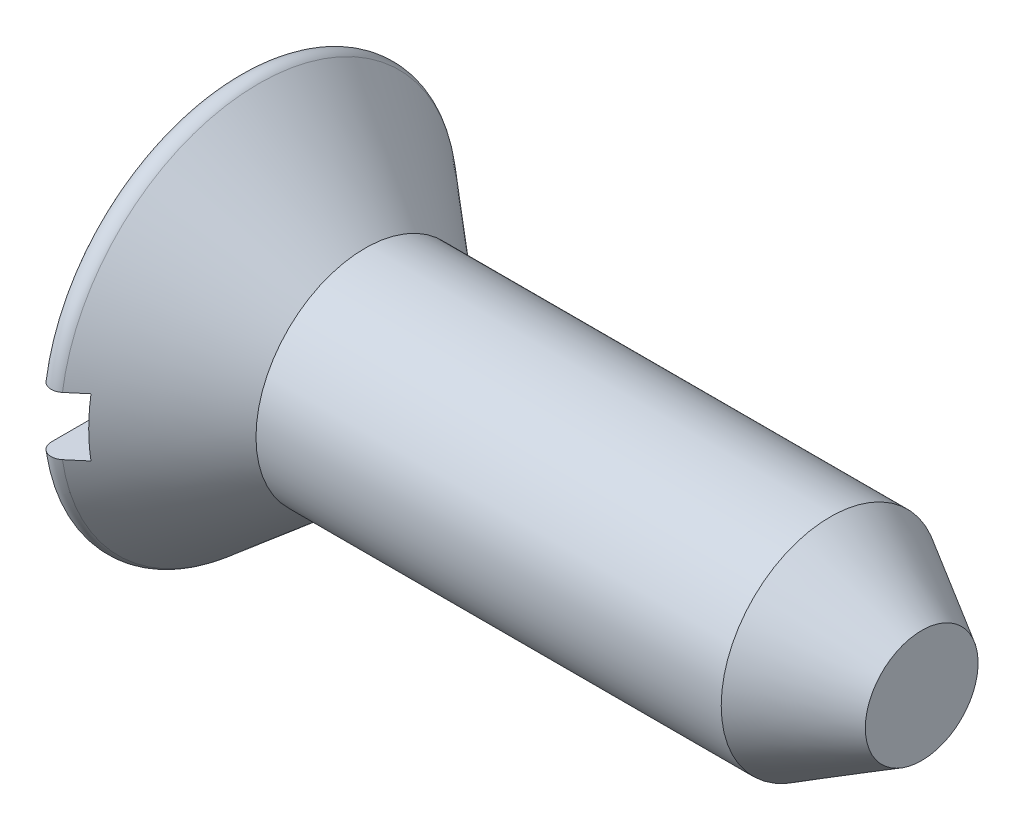
ISO-10303-21;
HEADER;
FILE_DESCRIPTION(('STEP AP214'),'2;1');
FILE_NAME('part.step','',(''),(''),'','','');
FILE_SCHEMA(('AUTOMOTIVE_DESIGN { 1 0 10303 214 1 1 1 1 }'));
ENDSEC;
DATA;
#1=APPLICATION_CONTEXT('core data for automotive mechanical design processes');
#2=APPLICATION_PROTOCOL_DEFINITION('international standard','automotive_design',2000,#1);
#3=PRODUCT_CONTEXT('',#1,'mechanical');
#4=PRODUCT('Part','Part','',(#3));
#5=PRODUCT_RELATED_PRODUCT_CATEGORY('part','',(#4));
#6=PRODUCT_DEFINITION_FORMATION('','',#4);
#7=PRODUCT_DEFINITION_CONTEXT('part definition',#1,'design');
#8=PRODUCT_DEFINITION('design','',#6,#7);
#9=PRODUCT_DEFINITION_SHAPE('','',#8);
#10=(LENGTH_UNIT() NAMED_UNIT(*) SI_UNIT(.MILLI.,.METRE.));
#11=(NAMED_UNIT(*) PLANE_ANGLE_UNIT() SI_UNIT($,.RADIAN.));
#12=(NAMED_UNIT(*) SI_UNIT($,.STERADIAN.) SOLID_ANGLE_UNIT());
#13=UNCERTAINTY_MEASURE_WITH_UNIT(LENGTH_MEASURE(1.E-05),#10,'distance_accuracy_value','');
#14=(GEOMETRIC_REPRESENTATION_CONTEXT(3) GLOBAL_UNCERTAINTY_ASSIGNED_CONTEXT((#13)) GLOBAL_UNIT_ASSIGNED_CONTEXT((#10,
#11,#12)) REPRESENTATION_CONTEXT('',''));
#15=CARTESIAN_POINT('',(0.,0.,0.));
#16=DIRECTION('',(0.,0.,1.));
#17=DIRECTION('',(1.,0.,0.));
#18=AXIS2_PLACEMENT_3D('',#15,#16,#17);
#19=CARTESIAN_POINT('',(0.,0.,0.));
#20=DIRECTION('',(-1.,0.,0.));
#21=DIRECTION('',(0.,0.,1.));
#22=AXIS2_PLACEMENT_3D('',#19,#20,#21);
#23=CYLINDRICAL_SURFACE('',#22,0.762);
#24=CARTESIAN_POINT('',(0.889,0.,0.));
#25=DIRECTION('',(-1.,0.,0.));
#26=DIRECTION('',(0.,0.,1.));
#27=AXIS2_PLACEMENT_3D('',#24,#25,#26);
#28=CIRCLE('',#27,0.762);
#29=CARTESIAN_POINT('',(0.889,0.,0.762));
#30=VERTEX_POINT('',#29);
#31=EDGE_CURVE('E164',#30,#30,#28,.T.);
#32=ORIENTED_EDGE('',*,*,#31,.F.);
#33=EDGE_LOOP('',(#32));
#34=FACE_BOUND('',#33,.T.);
#35=CARTESIAN_POINT('',(4.13728568757237,0.,0.));
#36=DIRECTION('',(-1.,0.,0.));
#37=DIRECTION('',(0.,0.,1.));
#38=AXIS2_PLACEMENT_3D('',#35,#36,#37);
#39=CIRCLE('',#38,0.762);
#40=CARTESIAN_POINT('',(4.13728568757237,0.,0.762));
#41=VERTEX_POINT('',#40);
#42=EDGE_CURVE('E213',#41,#41,#39,.T.);
#43=ORIENTED_EDGE('',*,*,#42,.T.);
#44=EDGE_LOOP('',(#43));
#45=FACE_BOUND('',#44,.T.);
#46=ADVANCED_FACE('F68',(#34,#45),#23,.T.);
#47=CARTESIAN_POINT('',(0.,0.,0.));
#48=DIRECTION('',(1.,0.,0.));
#49=DIRECTION('',(0.,0.,-1.));
#50=AXIS2_PLACEMENT_3D('',#47,#48,#49);
#51=PLANE('',#50);
#52=CARTESIAN_POINT('',(0.,0.,0.));
#53=DIRECTION('',(-1.,0.,0.));
#54=DIRECTION('',(0.,0.,1.));
#55=AXIS2_PLACEMENT_3D('',#52,#53,#54);
#56=CIRCLE('',#55,1.3173129068833);
#57=CARTESIAN_POINT('',(0.,0.2032,1.30154640894643));
#58=VERTEX_POINT('',#57);
#59=CARTESIAN_POINT('',(0.,0.2032,-1.30154640894642));
#60=VERTEX_POINT('',#59);
#61=EDGE_CURVE('E153',#58,#60,#56,.T.);
#62=ORIENTED_EDGE('',*,*,#61,.T.);
#63=DIRECTION('',(0.,0.,1.));
#64=VECTOR('',#63,1.);
#65=CARTESIAN_POINT('',(0.,0.2032,-1.4062129068833));
#66=LINE('',#65,#64);
#67=EDGE_CURVE('E198',#60,#58,#66,.T.);
#68=ORIENTED_EDGE('',*,*,#67,.T.);
#69=EDGE_LOOP('',(#62,#68));
#70=FACE_BOUND('',#69,.T.);
#71=ADVANCED_FACE('F225',(#70),#51,.F.);
#72=CARTESIAN_POINT('',(0.0889,0.,0.));
#73=DIRECTION('',(-1.,0.,0.));
#74=DIRECTION('',(0.,0.,1.));
#75=AXIS2_PLACEMENT_3D('',#72,#73,#74);
#76=TOROIDAL_SURFACE('',#75,1.3173129068833,0.0889000000000001);
#77=CARTESIAN_POINT('',(0.146043818501133,0.,0.));
#78=DIRECTION('',(-1.,0.,0.));
#79=DIRECTION('',(0.,0.,1.));
#80=AXIS2_PLACEMENT_3D('',#77,#78,#79);
#81=CIRCLE('',#80,1.38541425787658);
#82=CARTESIAN_POINT('',(0.146043818501124,0.2032,1.3704314743641));
#83=VERTEX_POINT('',#82);
#84=CARTESIAN_POINT('',(0.146043818501134,0.2032,-1.37043147436409));
#85=VERTEX_POINT('',#84);
#86=EDGE_CURVE('E160',#83,#85,#81,.T.);
#87=ORIENTED_EDGE('',*,*,#86,.T.);
#88=CARTESIAN_POINT('',(0.0523705260571728,0.2032,-1.38351851820252));
#89=CARTESIAN_POINT('',(0.0478176911994154,0.2032,-1.38144422272468));
#90=CARTESIAN_POINT('',(0.0434378443788568,0.2032,-1.37898096159876));
#91=CARTESIAN_POINT('',(0.0351518160236288,0.2032,-1.37334990482933));
#92=CARTESIAN_POINT('',(0.0312462580125439,0.2032,-1.37018119694036));
#93=CARTESIAN_POINT('',(0.0240245304576158,0.2032,-1.36323710717479));
#94=CARTESIAN_POINT('',(0.0207078233273633,0.2032,-1.35946228470495));
#95=CARTESIAN_POINT('',(0.0147503905893634,0.2032,-1.35141429144588));
#96=CARTESIAN_POINT('',(0.0121095022127912,0.2032,-1.34714124101486));
#97=CARTESIAN_POINT('',(0.00755405427631246,0.2032,-1.33818164094041));
#98=CARTESIAN_POINT('',(0.00564538069511222,0.2032,-1.33349209892135));
#99=CARTESIAN_POINT('',(0.00263372759919715,0.2032,-1.32386086837332));
#100=CARTESIAN_POINT('',(0.00153082569774927,0.2032,-1.31891915560388));
#101=CARTESIAN_POINT('',(0.000152174149981007,0.2032,-1.30887237508656));
#102=CARTESIAN_POINT('',(-0.000115390923046634,0.2032,-1.30376618321717));
#103=CARTESIAN_POINT('',(0.000206043899451252,0.2032,-1.29358074523499));
#104=CARTESIAN_POINT('',(0.000795075349108541,0.2032,-1.28850150012175));
#105=CARTESIAN_POINT('',(0.00281857260061189,0.2032,-1.27848876872158));
#106=CARTESIAN_POINT('',(0.00425707516640125,0.2032,-1.27355609730819));
#107=CARTESIAN_POINT('',(0.00794412166933677,0.2032,-1.26400323504905));
#108=CARTESIAN_POINT('',(0.0101926621885808,0.2032,-1.25938304288492));
#109=CARTESIAN_POINT('',(0.015431154367101,0.2032,-1.25060241035431));
#110=CARTESIAN_POINT('',(0.0184188897560083,0.2032,-1.24644064846124));
#111=CARTESIAN_POINT('',(0.025057323142709,0.2032,-1.23868432814038));
#112=CARTESIAN_POINT('',(0.0287079888885195,0.2032,-1.23508974213503));
#113=CARTESIAN_POINT('',(0.036529543885261,0.2032,-1.22861027181804));
#114=CARTESIAN_POINT('',(0.0406947268231962,0.2032,-1.2257185009037));
#115=CARTESIAN_POINT('',(0.049456603032649,0.2032,-1.22068615885088));
#116=CARTESIAN_POINT('',(0.0540532628784797,0.2032,-1.21854552958367));
#117=CARTESIAN_POINT('',(0.0634830486287582,0.2032,-1.21510523257623));
#118=CARTESIAN_POINT('',(0.068312299574889,0.2032,-1.21379494107223));
#119=CARTESIAN_POINT('',(0.0781229945303598,0.2032,-1.21201227043655));
#120=CARTESIAN_POINT('',(0.0831044289937725,0.2032,-1.21153983885826));
#121=CARTESIAN_POINT('',(0.0930285365737473,0.2032,-1.21144808744044));
#122=CARTESIAN_POINT('',(0.0979711385161175,0.2032,-1.21182086184307));
#123=CARTESIAN_POINT('',(0.107723284516137,0.2032,-1.21339163580157));
#124=CARTESIAN_POINT('',(0.112532830720643,0.2032,-1.21458962203455));
#125=CARTESIAN_POINT('',(0.121880179357037,0.2032,-1.21777299744883));
#126=CARTESIAN_POINT('',(0.126418153919348,0.2032,-1.21975788165377));
#127=CARTESIAN_POINT('',(0.135100241639459,0.2032,-1.22445530379448));
#128=CARTESIAN_POINT('',(0.139244341144223,0.2032,-1.2271678669416));
#129=CARTESIAN_POINT('',(0.147058785243054,0.2032,-1.23326619394751));
#130=CARTESIAN_POINT('',(0.150724928905993,0.2032,-1.23665733913592));
#131=CARTESIAN_POINT('',(0.157444725568322,0.2032,-1.2440000363637));
#132=CARTESIAN_POINT('',(0.160498338768601,0.2032,-1.24795162478937));
#133=CARTESIAN_POINT('',(0.165947827436118,0.2032,-1.25635718007483));
#134=CARTESIAN_POINT('',(0.168334781786057,0.2032,-1.2608169309155));
#135=CARTESIAN_POINT('',(0.172335577477156,0.2032,-1.27007068730065));
#136=CARTESIAN_POINT('',(0.17394936864905,0.2032,-1.27486471451267));
#137=CARTESIAN_POINT('',(0.176375011779177,0.2032,-1.28470805384686));
#138=CARTESIAN_POINT('',(0.177177781162091,0.2032,-1.28975960579701));
#139=CARTESIAN_POINT('',(0.177928121542145,0.2032,-1.29992591539745));
#140=CARTESIAN_POINT('',(0.177875663162288,0.2032,-1.30504067521289));
#141=CARTESIAN_POINT('',(0.176913953003756,0.2032,-1.31521251318227));
#142=CARTESIAN_POINT('',(0.176000832504561,0.2032,-1.32026922647207));
#143=CARTESIAN_POINT('',(0.173335740450384,0.2032,-1.33015669985423));
#144=CARTESIAN_POINT('',(0.171583773579977,0.2032,-1.33498746120827));
#145=CARTESIAN_POINT('',(0.1672950951694,0.2032,-1.34426719603872));
#146=CARTESIAN_POINT('',(0.164761088604788,0.2032,-1.34871741901477));
#147=CARTESIAN_POINT('',(0.158975322179547,0.2032,-1.35712403812421));
#148=CARTESIAN_POINT('',(0.155723593179799,0.2032,-1.36108045547897));
#149=CARTESIAN_POINT('',(0.148626084326047,0.2032,-1.3683476561999));
#150=CARTESIAN_POINT('',(0.144786038152907,0.2032,-1.371664038558));
#151=CARTESIAN_POINT('',(0.136598649010813,0.2032,-1.3775964489811));
#152=CARTESIAN_POINT('',(0.13225135698471,0.2032,-1.38021254728906));
#153=CARTESIAN_POINT('',(0.123223844102275,0.2032,-1.38464056074995));
#154=CARTESIAN_POINT('',(0.118547773328544,0.2032,-1.38646093881404));
#155=CARTESIAN_POINT('',(0.108953581658436,0.2032,-1.38928396219947));
#156=CARTESIAN_POINT('',(0.104035411787491,0.2032,-1.39028644134007));
#157=CARTESIAN_POINT('',(0.0941387237719009,0.2032,-1.39143812964163));
#158=CARTESIAN_POINT('',(0.0891609499961608,0.2032,-1.39159377597214));
#159=CARTESIAN_POINT('',(0.0792546536102657,0.2032,-1.39106395624113));
#160=CARTESIAN_POINT('',(0.0743260770652091,0.2032,-1.39037954472566));
#161=CARTESIAN_POINT('',(0.0665501614656429,0.2032,-1.38862203209876));
#162=CARTESIAN_POINT('',(0.0636423816525081,0.2032,-1.38780545738067));
#163=CARTESIAN_POINT('',(0.0579255993947736,0.2032,-1.38587926170669));
#164=CARTESIAN_POINT('',(0.0551165964312887,0.2032,-1.38476964229045));
#165=CARTESIAN_POINT('',(0.0523705260571728,0.2032,-1.38351851820252));
#166=B_SPLINE_CURVE_WITH_KNOTS('',3,(#88,#89,#90,#91,#92,#93,#94,#95,#96,#97,#98,#99,#100,#101,
#102,#103,#104,#105,#106,#107,#108,#109,#110,#111,#112,#113,#114,#115,#116,#117,#118,#119,#120,
#121,#122,#123,#124,#125,#126,#127,#128,#129,#130,#131,#132,#133,#134,#135,#136,#137,#138,#139,
#140,#141,#142,#143,#144,#145,#146,#147,#148,#149,#150,#151,#152,#153,#154,#155,#156,#157,#158,
#159,#160,#161,#162,#163,#164,#165),.UNSPECIFIED.,.T.,.F.,(4,2,2,2,2,2,2,2,2,2,2,2,2,2,2,2,2,2,
2,2,2,2,2,2,2,2,2,2,2,2,2,2,2,2,2,2,2,2,4),(0.,0.0149981452684923,0.030015799157367,
0.0450196715059772,0.0600199268108142,0.075138355282125,0.0902582397936636,0.105525810312758,
0.120793943251991,0.136135222332715,0.151476436682675,0.166772200535348,0.182067220438667,
0.197205711261049,0.212343030299978,0.227282541806836,0.242221118127957,0.257020541353579,
0.271819725650868,0.286609428194935,0.301399643213061,0.316312161064546,0.331225647541866,
0.346330062522076,0.361435457469809,0.37670820161156,0.391981470371799,0.4073237223347,
0.422665888619108,0.437955572041762,0.453244598161255,0.468393124557555,0.483540130890253,
0.498521869958998,0.513506652260303,0.528377367454222,0.543229434136708,0.552275705320038,
0.561321928975245),.UNSPECIFIED.);
#167=EDGE_CURVE('E171',#85,#60,#166,.T.);
#168=ORIENTED_EDGE('',*,*,#167,.T.);
#169=ORIENTED_EDGE('',*,*,#61,.F.);
#170=CARTESIAN_POINT('',(0.0505339825479932,0.2032,1.22031559709616));
#171=CARTESIAN_POINT('',(0.046022360190876,0.2032,1.22250397816378));
#172=CARTESIAN_POINT('',(0.0416938618429052,0.2032,1.22507887974568));
#173=CARTESIAN_POINT('',(0.0335289146536868,0.2032,1.23092350038039));
#174=CARTESIAN_POINT('',(0.0296931348289091,0.2032,1.23419414845723));
#175=CARTESIAN_POINT('',(0.0226268431148383,0.2032,1.24132795738513));
#176=CARTESIAN_POINT('',(0.019395709317121,0.2032,1.24519050191818));
#177=CARTESIAN_POINT('',(0.0136214738029604,0.2032,1.25339760832912));
#178=CARTESIAN_POINT('',(0.0110782049312717,0.2032,1.25774205273998));
#179=CARTESIAN_POINT('',(0.00672420765881694,0.2032,1.26683485447658));
#180=CARTESIAN_POINT('',(0.00492070691249398,0.2032,1.271586672922));
#181=CARTESIAN_POINT('',(0.00212891806369629,0.2032,1.28132430281562));
#182=CARTESIAN_POINT('',(0.00114070876341374,0.2032,1.28631013683345));
#183=CARTESIAN_POINT('',(8.02056667534702E-07,0.2032,1.29642193072192));
#184=CARTESIAN_POINT('',(-0.000143324242251581,0.2032,1.30154874564883));
#185=CARTESIAN_POINT('',(0.000429758760486753,0.2032,1.31175411761621));
#186=CARTESIAN_POINT('',(0.00114698364483488,0.2032,1.31683267378196));
#187=CARTESIAN_POINT('',(0.00342616846316346,0.2032,1.3268042775906));
#188=CARTESIAN_POINT('',(0.0049893143388221,0.2032,1.33169705444917));
#189=CARTESIAN_POINT('',(0.00891975704861599,0.2032,1.34114832832208));
#190=CARTESIAN_POINT('',(0.0112870330609027,0.2032,1.3457068339882));
#191=CARTESIAN_POINT('',(0.0167446626189984,0.2032,1.35432961935332));
#192=CARTESIAN_POINT('',(0.0198305451819823,0.2032,1.3583967279404));
#193=CARTESIAN_POINT('',(0.0266478948671658,0.2032,1.36594827372239));
#194=CARTESIAN_POINT('',(0.0303793279907463,0.2032,1.3694327415837));
#195=CARTESIAN_POINT('',(0.0383405732510331,0.2032,1.37568129636799));
#196=CARTESIAN_POINT('',(0.0425648163415173,0.2032,1.37845247846991));
#197=CARTESIAN_POINT('',(0.0514223555663436,0.2032,1.38323774552473));
#198=CARTESIAN_POINT('',(0.0560556270622841,0.2032,1.38525187604132));
#199=CARTESIAN_POINT('',(0.0655486973042661,0.2032,1.38844509183823));
#200=CARTESIAN_POINT('',(0.0704056974884498,0.2032,1.3896324997109));
#201=CARTESIAN_POINT('',(0.0802504629919815,0.2032,1.39116939537549));
#202=CARTESIAN_POINT('',(0.085238222824734,0.2032,1.39151891826783));
#203=CARTESIAN_POINT('',(0.0951701675507164,0.2032,1.39136993806661));
#204=CARTESIAN_POINT('',(0.100114431553848,0.2032,1.39087664782308));
#205=CARTESIAN_POINT('',(0.109849837622273,0.2032,1.38906691509969));
#206=CARTESIAN_POINT('',(0.114640981261118,0.2032,1.38775048108177));
#207=CARTESIAN_POINT('',(0.123935144841926,0.2032,1.3843337741045));
#208=CARTESIAN_POINT('',(0.128438154113818,0.2032,1.38223347213695));
#209=CARTESIAN_POINT('',(0.137030565022314,0.2032,1.37731112774396));
#210=CARTESIAN_POINT('',(0.141119956834151,0.2032,1.37448906818005));
#211=CARTESIAN_POINT('',(0.148796924534544,0.2032,1.36818585521373));
#212=CARTESIAN_POINT('',(0.152381252773878,0.2032,1.36470074742102));
#213=CARTESIAN_POINT('',(0.158921048571228,0.2032,1.35718357066624));
#214=CARTESIAN_POINT('',(0.161876485284487,0.2032,1.35315147489235));
#215=CARTESIAN_POINT('',(0.167106739124593,0.2032,1.34461137440434));
#216=CARTESIAN_POINT('',(0.169374368047431,0.2032,1.34009896768549));
#217=CARTESIAN_POINT('',(0.173128744823218,0.2032,1.33076025386597));
#218=CARTESIAN_POINT('',(0.174615447015387,0.2032,1.32593392842901));
#219=CARTESIAN_POINT('',(0.176781012512135,0.2032,1.3160508558175));
#220=CARTESIAN_POINT('',(0.17745135494799,0.2032,1.31099224071179));
#221=CARTESIAN_POINT('',(0.177939118769774,0.2032,1.30083399335894));
#222=CARTESIAN_POINT('',(0.17775650286015,0.2032,1.29573435932798));
#223=CARTESIAN_POINT('',(0.17653988534682,0.2032,1.28560487606266));
#224=CARTESIAN_POINT('',(0.175500522134343,0.2032,1.28057566968653));
#225=CARTESIAN_POINT('',(0.172591481549488,0.2032,1.27076324509045));
#226=CARTESIAN_POINT('',(0.170721795099058,0.2032,1.26598002956059));
#227=CARTESIAN_POINT('',(0.166204707617217,0.2032,1.25680196176453));
#228=CARTESIAN_POINT('',(0.163558103977199,0.2032,1.25240671728952));
#229=CARTESIAN_POINT('',(0.157558425660052,0.2032,1.24412800137498));
#230=CARTESIAN_POINT('',(0.154205377457412,0.2032,1.24024451076599));
#231=CARTESIAN_POINT('',(0.146918136460609,0.2032,1.23313728015562));
#232=CARTESIAN_POINT('',(0.14298928688198,0.2032,1.22990806329491));
#233=CARTESIAN_POINT('',(0.134639378493955,0.2032,1.22416552102562));
#234=CARTESIAN_POINT('',(0.130218375763966,0.2032,1.22165211416848));
#235=CARTESIAN_POINT('',(0.121071540696351,0.2032,1.21744707731726));
#236=CARTESIAN_POINT('',(0.116350448769702,0.2032,1.21574513412656));
#237=CARTESIAN_POINT('',(0.106686482655857,0.2032,1.21316740208243));
#238=CARTESIAN_POINT('',(0.101743567449631,0.2032,1.2122917666928));
#239=CARTESIAN_POINT('',(0.0918327728676808,0.2032,1.21139933497423));
#240=CARTESIAN_POINT('',(0.0868656743034488,0.2032,1.21137379023067));
#241=CARTESIAN_POINT('',(0.0770026144411505,0.2032,1.21216050931684));
#242=CARTESIAN_POINT('',(0.0721065711473121,0.2032,1.21297171399455));
#243=CARTESIAN_POINT('',(0.0644247118200177,0.2032,1.21492056495721));
#244=CARTESIAN_POINT('',(0.0615712542986191,0.2032,1.21580160411902));
#245=CARTESIAN_POINT('',(0.0559682444172038,0.2032,1.21784800691337));
#246=CARTESIAN_POINT('',(0.0532186911599176,0.2032,1.21901336808998));
#247=CARTESIAN_POINT('',(0.0505339825479932,0.2032,1.22031559709616));
#248=B_SPLINE_CURVE_WITH_KNOTS('',3,(#170,#171,#172,#173,#174,#175,#176,#177,#178,#179,#180,
#181,#182,#183,#184,#185,#186,#187,#188,#189,#190,#191,#192,#193,#194,#195,#196,#197,#198,#199,
#200,#201,#202,#203,#204,#205,#206,#207,#208,#209,#210,#211,#212,#213,#214,#215,#216,#217,#218,
#219,#220,#221,#222,#223,#224,#225,#226,#227,#228,#229,#230,#231,#232,#233,#234,#235,#236,#237,
#238,#239,#240,#241,#242,#243,#244,#245,#246,#247),.UNSPECIFIED.,.T.,.F.,(4,2,2,2,2,2,2,2,2,2,2,
2,2,2,2,2,2,2,2,2,2,2,2,2,2,2,2,2,2,2,2,2,2,2,2,2,2,2,4),(0.,0.0150319921922779,
0.03008418389658,0.0451208075416984,0.0601537739086061,0.0753303039585673,0.0905083007279189,
0.105822232397158,0.121136441114667,0.13647217546799,0.151807512753742,0.167049873057424,
0.182291430849945,0.197374944565268,0.21245755032306,0.227386034595826,0.242313893477856,
0.257149756536103,0.271985467083563,0.28682172670327,0.301658338649959,0.316586378751056,
0.331515150847495,0.346594954827096,0.361675640424612,0.376912419695567,0.392149865200053,
0.407483398617733,0.422817099683431,0.438135117655419,0.453452561676344,0.468635942568744,
0.483817595126932,0.498800784822775,0.513786756683713,0.528618457366173,0.543431407188434,
0.552376497065563,0.561321509679334),.UNSPECIFIED.);
#249=EDGE_CURVE('E167',#58,#83,#248,.T.);
#250=ORIENTED_EDGE('',*,*,#249,.T.);
#251=EDGE_LOOP('',(#87,#168,#169,#250));
#252=FACE_BOUND('',#251,.T.);
#253=ADVANCED_FACE('F205',(#252),#76,.T.);
#254=CARTESIAN_POINT('',(0.,-0.2032,-1.30154640894645));
#255=VERTEX_POINT('',#254);
#256=CARTESIAN_POINT('',(0.,-0.2032,1.30154640894642));
#257=VERTEX_POINT('',#256);
#258=EDGE_CURVE('E155',#255,#257,#56,.T.);
#259=ORIENTED_EDGE('',*,*,#258,.T.);
#260=DIRECTION('',(0.,0.,1.));
#261=VECTOR('',#260,1.);
#262=CARTESIAN_POINT('',(0.,-0.2032,-1.4062129068833));
#263=LINE('',#262,#261);
#264=EDGE_CURVE('E140',#255,#257,#263,.T.);
#265=ORIENTED_EDGE('',*,*,#264,.F.);
#266=EDGE_LOOP('',(#259,#265));
#267=FACE_BOUND('',#266,.T.);
#268=ADVANCED_FACE('F70',(#267),#51,.F.);
#269=ORIENTED_EDGE('',*,*,#258,.F.);
#270=CARTESIAN_POINT('',(0.0523705260571728,-0.2032,-1.38351851820252));
#271=CARTESIAN_POINT('',(0.0568738869315067,-0.2032,-1.38556977864343));
#272=CARTESIAN_POINT('',(0.0615529950224517,-0.2032,-1.38724351739871));
#273=CARTESIAN_POINT('',(0.0711294816637933,-0.2032,-1.38978319032185));
#274=CARTESIAN_POINT('',(0.0760270977246517,-0.2032,-1.39064822187822));
#275=CARTESIAN_POINT('',(0.085896824871141,-0.2032,-1.39154221376192));
#276=CARTESIAN_POINT('',(0.0908689097175361,-0.2032,-1.39157146195357));
#277=CARTESIAN_POINT('',(0.100745903817341,-0.2032,-1.39079351802843));
#278=CARTESIAN_POINT('',(0.105650828358372,-0.2032,-1.38998651958387));
#279=CARTESIAN_POINT('',(0.115250174320876,-0.2032,-1.38756210636323));
#280=CARTESIAN_POINT('',(0.11994482516555,-0.2032,-1.38594559950222));
#281=CARTESIAN_POINT('',(0.128997937802608,-0.2032,-1.38195064861717));
#282=CARTESIAN_POINT('',(0.133356383511365,-0.2032,-1.3795721681693));
#283=CARTESIAN_POINT('',(0.141634598549902,-0.2032,-1.37411112551113));
#284=CARTESIAN_POINT('',(0.145552363884049,-0.2032,-1.37102552651549));
#285=CARTESIAN_POINT('',(0.15282015249136,-0.2032,-1.36424588588495));
#286=CARTESIAN_POINT('',(0.156170152340115,-0.2032,-1.36055181915877));
#287=CARTESIAN_POINT('',(0.162240866998053,-0.2032,-1.35262411672948));
#288=CARTESIAN_POINT('',(0.164955489970198,-0.2032,-1.34838581678166));
#289=CARTESIAN_POINT('',(0.169643430037304,-0.2032,-1.33951742871808));
#290=CARTESIAN_POINT('',(0.17161670582861,-0.2032,-1.3348873187905));
#291=CARTESIAN_POINT('',(0.174787843067183,-0.2032,-1.32531348340902));
#292=CARTESIAN_POINT('',(0.175977152187734,-0.2032,-1.32036692464392));
#293=CARTESIAN_POINT('',(0.177515761242304,-0.2032,-1.3103448060864));
#294=CARTESIAN_POINT('',(0.177865017072497,-0.2032,-1.30526923953505));
#295=CARTESIAN_POINT('',(0.177714472162631,-0.2032,-1.29508994048273));
#296=CARTESIAN_POINT('',(0.177207854788847,-0.2032,-1.28998630760395));
#297=CARTESIAN_POINT('',(0.175346450120294,-0.2032,-1.27993599750868));
#298=CARTESIAN_POINT('',(0.173991644274783,-0.2032,-1.27498932372753));
#299=CARTESIAN_POINT('',(0.170467529105051,-0.2032,-1.26538662370606));
#300=CARTESIAN_POINT('',(0.16829701852541,-0.2032,-1.26073103799142));
#301=CARTESIAN_POINT('',(0.163200281892077,-0.2032,-1.25185353800251));
#302=CARTESIAN_POINT('',(0.160274074018854,-0.2032,-1.2476316132987));
#303=CARTESIAN_POINT('',(0.153767751125295,-0.2032,-1.23977238428597));
#304=CARTESIAN_POINT('',(0.150192042465925,-0.2032,-1.23613143358229));
#305=CARTESIAN_POINT('',(0.14247343220887,-0.2032,-1.22951058927975));
#306=CARTESIAN_POINT('',(0.138330568305628,-0.2032,-1.22653065178289));
#307=CARTESIAN_POINT('',(0.12964941864497,-0.2032,-1.2213558530589));
#308=CARTESIAN_POINT('',(0.125116605490789,-0.2032,-1.21915181179969));
#309=CARTESIAN_POINT('',(0.11574215598987,-0.2032,-1.21554678270195));
#310=CARTESIAN_POINT('',(0.110900543088878,-0.2032,-1.21414573397635));
#311=CARTESIAN_POINT('',(0.101109367186439,-0.2032,-1.21220274985597));
#312=CARTESIAN_POINT('',(0.0961618387659196,-0.2032,-1.21165055289154));
#313=CARTESIAN_POINT('',(0.086244713661789,-0.2032,-1.21138997353124));
#314=CARTESIAN_POINT('',(0.0812751179651708,-0.2032,-1.21168155376823));
#315=CARTESIAN_POINT('',(0.0714850068829292,-0.2032,-1.21309522115609));
#316=CARTESIAN_POINT('',(0.066663796652455,-0.2032,-1.21421250563169));
#317=CARTESIAN_POINT('',(0.0572763452795233,-0.2032,-1.21723776664842));
#318=CARTESIAN_POINT('',(0.0527101062802414,-0.2032,-1.21914574983468));
#319=CARTESIAN_POINT('',(0.0439429991238042,-0.2032,-1.2237033270949));
#320=CARTESIAN_POINT('',(0.0397435317435436,-0.2032,-1.22635561419743));
#321=CARTESIAN_POINT('',(0.0318431629909132,-0.2032,-1.23232032620685));
#322=CARTESIAN_POINT('',(0.0281422869444045,-0.2032,-1.23563278462586));
#323=CARTESIAN_POINT('',(0.0212998583799315,-0.2032,-1.24286228473645));
#324=CARTESIAN_POINT('',(0.0181649374636797,-0.2032,-1.2467856019428));
#325=CARTESIAN_POINT('',(0.0125883328527559,-0.2032,-1.25509730226339));
#326=CARTESIAN_POINT('',(0.0101466981635355,-0.2032,-1.25948571822339));
#327=CARTESIAN_POINT('',(0.00599383119983193,-0.2032,-1.26866335675254));
#328=CARTESIAN_POINT('',(0.00429233350146967,-0.2032,-1.27345698533044));
#329=CARTESIAN_POINT('',(0.00171053826733786,-0.2032,-1.28326056390028));
#330=CARTESIAN_POINT('',(0.000830286667440538,-0.2032,-1.28827052597629));
#331=CARTESIAN_POINT('',(-8.94328821223963E-05,-0.2032,-1.29841043180401));
#332=CARTESIAN_POINT('',(-0.00012164423251248,-0.2032,-1.30354103530056));
#333=CARTESIAN_POINT('',(0.000674810675428988,-0.2032,-1.31373491057774));
#334=CARTESIAN_POINT('',(0.00150345821041084,-0.2032,-1.31879818382035));
#335=CARTESIAN_POINT('',(0.00400129511261879,-0.2032,-1.32871729903732));
#336=CARTESIAN_POINT('',(0.00567113217204995,-0.2032,-1.33357297803977));
#337=CARTESIAN_POINT('',(0.00980803669808783,-0.2032,-1.34293367869137));
#338=CARTESIAN_POINT('',(0.0122752810995478,-0.2032,-1.34743862224109));
#339=CARTESIAN_POINT('',(0.0179219347837412,-0.2032,-1.3559381838167));
#340=CARTESIAN_POINT('',(0.0210969932093923,-0.2032,-1.35993569487923));
#341=CARTESIAN_POINT('',(0.0280775177618349,-0.2032,-1.3673298802076));
#342=CARTESIAN_POINT('',(0.0318821810161565,-0.2032,-1.37072730843663));
#343=CARTESIAN_POINT('',(0.0384979433797086,-0.2032,-1.37568731174336));
#344=CARTESIAN_POINT('',(0.0411524940783324,-0.2032,-1.37746243450377));
#345=CARTESIAN_POINT('',(0.0466371922972352,-0.2032,-1.3807168425844));
#346=CARTESIAN_POINT('',(0.0494673388170149,-0.2032,-1.38219612959001));
#347=CARTESIAN_POINT('',(0.0523705260571728,-0.2032,-1.38351851820252));
#348=B_SPLINE_CURVE_WITH_KNOTS('',3,(#270,#271,#272,#273,#274,#275,#276,#277,#278,#279,#280,
#281,#282,#283,#284,#285,#286,#287,#288,#289,#290,#291,#292,#293,#294,#295,#296,#297,#298,#299,
#300,#301,#302,#303,#304,#305,#306,#307,#308,#309,#310,#311,#312,#313,#314,#315,#316,#317,#318,
#319,#320,#321,#322,#323,#324,#325,#326,#327,#328,#329,#330,#331,#332,#333,#334,#335,#336,#337,
#338,#339,#340,#341,#342,#343,#344,#345,#346,#347),.UNSPECIFIED.,.T.,.F.,(4,2,2,2,2,2,2,2,2,2,2,
2,2,2,2,2,2,2,2,2,2,2,2,2,2,2,2,2,2,2,2,2,2,2,2,2,2,2,4),(0.,0.0148340012625774,
0.0296845393021099,0.044529962389818,0.0593719480900148,0.074197324718111,0.0890234101340763,
0.103914402057001,0.118806008190924,0.133835023770037,0.148864876556438,0.164056090489379,
0.179248101962218,0.194561682035036,0.209875597043092,0.225212153175321,0.240548340376994,
0.255784125898675,0.271018899306144,0.286066832248387,0.301113624027129,0.315977047058377,
0.330839811864953,0.345616801714081,0.360393915753377,0.375225201179755,0.390057239674916,
0.405053153467774,0.420050126994201,0.435238785392362,0.450428293307434,0.465747734529259,
0.481066842566105,0.496397763954011,0.511732089422387,0.526974635375748,0.542197891727271,
0.551761000202218,0.561324054194059),.UNSPECIFIED.);
#349=CARTESIAN_POINT('',(0.146043818501124,-0.2032,-1.3704314743641));
#350=VERTEX_POINT('',#349);
#351=EDGE_CURVE('E197',#255,#350,#348,.T.);
#352=ORIENTED_EDGE('',*,*,#351,.T.);
#353=CARTESIAN_POINT('',(0.146043818501133,-0.2032,1.37043147436409));
#354=VERTEX_POINT('',#353);
#355=EDGE_CURVE('E146',#350,#354,#81,.T.);
#356=ORIENTED_EDGE('',*,*,#355,.T.);
#357=CARTESIAN_POINT('',(0.0505339825479932,-0.2032,1.22031559709616));
#358=CARTESIAN_POINT('',(0.05497646615682,-0.2032,1.21816125152755));
#359=CARTESIAN_POINT('',(0.059602889478724,-0.2032,1.21637848037792));
#360=CARTESIAN_POINT('',(0.0690928683098398,-0.2032,1.21361305110179));
#361=CARTESIAN_POINT('',(0.0739566728862113,-0.2032,1.21263125337525));
#362=CARTESIAN_POINT('',(0.0837793768362527,-0.2032,1.21150030271955));
#363=CARTESIAN_POINT('',(0.0887382515048846,-0.2032,1.21135093633939));
#364=CARTESIAN_POINT('',(0.0986091066424504,-0.2032,1.21188917263747));
#365=CARTESIAN_POINT('',(0.103521097456153,-0.2032,1.21257658616909));
#366=CARTESIAN_POINT('',(0.113149231726987,-0.2032,1.21476429271532));
#367=CARTESIAN_POINT('',(0.117865776333502,-0.2032,1.21626282185985));
#368=CARTESIAN_POINT('',(0.126982592943378,-0.2032,1.22002606775215));
#369=CARTESIAN_POINT('',(0.131382848161706,-0.2032,1.22229082512621));
#370=CARTESIAN_POINT('',(0.139770456665416,-0.2032,1.22753418009996));
#371=CARTESIAN_POINT('',(0.143755282545398,-0.2032,1.23051681887917));
#372=CARTESIAN_POINT('',(0.151175176282735,-0.2032,1.23710141120585));
#373=CARTESIAN_POINT('',(0.154610212646939,-0.2032,1.24070340020657));
#374=CARTESIAN_POINT('',(0.160877454036404,-0.2032,1.24847052052895));
#375=CARTESIAN_POINT('',(0.163701900627754,-0.2032,1.25264191159921));
#376=CARTESIAN_POINT('',(0.168620360830881,-0.2032,1.26139508591017));
#377=CARTESIAN_POINT('',(0.170714325906445,-0.2032,1.26597689639542));
#378=CARTESIAN_POINT('',(0.174138195104187,-0.2032,1.2754812966625));
#379=CARTESIAN_POINT('',(0.175458417895567,-0.2032,1.28040737549475));
#380=CARTESIAN_POINT('',(0.177259483144653,-0.2032,1.2904107334191));
#381=CARTESIAN_POINT('',(0.177740285464561,-0.2032,1.29548801972955));
#382=CARTESIAN_POINT('',(0.177849620300328,-0.2032,1.30568694566465));
#383=CARTESIAN_POINT('',(0.177472256892997,-0.2032,1.31080864982556));
#384=CARTESIAN_POINT('',(0.17586224100372,-0.2032,1.32091594628616));
#385=CARTESIAN_POINT('',(0.174629583558533,-0.2032,1.32590153779581));
#386=CARTESIAN_POINT('',(0.171342912582113,-0.2032,1.33558868070765));
#387=CARTESIAN_POINT('',(0.169289746040575,-0.2032,1.34029051927733));
#388=CARTESIAN_POINT('',(0.16441718274424,-0.2032,1.34927898188929));
#389=CARTESIAN_POINT('',(0.16159781264843,-0.2032,1.35356562037083));
#390=CARTESIAN_POINT('',(0.155295369346087,-0.2032,1.36156540151497));
#391=CARTESIAN_POINT('',(0.151817642122356,-0.2032,1.36528275490481));
#392=CARTESIAN_POINT('',(0.144281402032941,-0.2032,1.37207299273043));
#393=CARTESIAN_POINT('',(0.140222923126113,-0.2032,1.37514591482279));
#394=CARTESIAN_POINT('',(0.13168742473562,-0.2032,1.38052482920098));
#395=CARTESIAN_POINT('',(0.127215398827258,-0.2032,1.38283874584233));
#396=CARTESIAN_POINT('',(0.117943747525303,-0.2032,1.3866747986542));
#397=CARTESIAN_POINT('',(0.11314414065771,-0.2032,1.38819697955862));
#398=CARTESIAN_POINT('',(0.103401814538097,-0.2032,1.39039274090956));
#399=CARTESIAN_POINT('',(0.0984608507319749,-0.2032,1.39107411477661));
#400=CARTESIAN_POINT('',(0.0885348566885375,-0.2032,1.39159359434429));
#401=CARTESIAN_POINT('',(0.0835498279327388,-0.2032,1.3914317282888));
#402=CARTESIAN_POINT('',(0.073700406882297,-0.2032,1.39027227711033));
#403=CARTESIAN_POINT('',(0.0688355790411138,-0.2032,1.38927838599898));
#404=CARTESIAN_POINT('',(0.0593413489156044,-0.2032,1.38648952973411));
#405=CARTESIAN_POINT('',(0.0547119468040556,-0.2032,1.3846945639927));
#406=CARTESIAN_POINT('',(0.04580915438365,-0.2032,1.38035246069457));
#407=CARTESIAN_POINT('',(0.0415364941703807,-0.2032,1.37780382686052));
#408=CARTESIAN_POINT('',(0.0334754766450085,-0.2032,1.37203056275749));
#409=CARTESIAN_POINT('',(0.0296871346657004,-0.2032,1.36880591109531));
#410=CARTESIAN_POINT('',(0.0226704223789446,-0.2032,1.36174652352465));
#411=CARTESIAN_POINT('',(0.0194465705972939,-0.2032,1.35790729735676));
#412=CARTESIAN_POINT('',(0.0136811130818397,-0.2032,1.34974691816245));
#413=CARTESIAN_POINT('',(0.0111395454079594,-0.2032,1.34542573827018));
#414=CARTESIAN_POINT('',(0.00678214111538742,-0.2032,1.33637504588101));
#415=CARTESIAN_POINT('',(0.00497430427168451,-0.2032,1.33164168187396));
#416=CARTESIAN_POINT('',(0.00217045768061073,-0.2032,1.32194031724727));
#417=CARTESIAN_POINT('',(0.00117449520380307,-0.2032,1.31697230298316));
#418=CARTESIAN_POINT('',(1.4106707228817E-05,-0.2032,1.306891715346));
#419=CARTESIAN_POINT('',(-0.000142255693305347,-0.2032,1.30177821268967));
#420=CARTESIAN_POINT('',(0.000401656212493473,-0.2032,1.29159706192001));
#421=CARTESIAN_POINT('',(0.00110192882772748,-0.2032,1.28652941371617));
#422=CARTESIAN_POINT('',(0.00334487407938189,-0.2032,1.2765613566222));
#423=CARTESIAN_POINT('',(0.00489110435797027,-0.2032,1.27166174754273));
#424=CARTESIAN_POINT('',(0.00878745473193406,-0.2032,1.26219159798943));
#425=CARTESIAN_POINT('',(0.0111377690592034,-0.2032,1.2576211373468));
#426=CARTESIAN_POINT('',(0.0165696876007433,-0.2032,1.24895726131503));
#427=CARTESIAN_POINT('',(0.0196490652932139,-0.2032,1.24486244898926));
#428=CARTESIAN_POINT('',(0.0264562735958137,-0.2032,1.23725886640256));
#429=CARTESIAN_POINT('',(0.0301832829752812,-0.2032,1.23374936485145));
#430=CARTESIAN_POINT('',(0.0367087728364152,-0.2032,1.22858335230373));
#431=CARTESIAN_POINT('',(0.0393459217273964,-0.2032,1.22671953085729));
#432=CARTESIAN_POINT('',(0.0448071999515419,-0.2032,1.22328946323243));
#433=CARTESIAN_POINT('',(0.0476313281576819,-0.2032,1.2217232152606));
#434=CARTESIAN_POINT('',(0.0505339825479932,-0.2032,1.22031559709616));
#435=B_SPLINE_CURVE_WITH_KNOTS('',3,(#357,#358,#359,#360,#361,#362,#363,#364,#365,#366,#367,
#368,#369,#370,#371,#372,#373,#374,#375,#376,#377,#378,#379,#380,#381,#382,#383,#384,#385,#386,
#387,#388,#389,#390,#391,#392,#393,#394,#395,#396,#397,#398,#399,#400,#401,#402,#403,#404,#405,
#406,#407,#408,#409,#410,#411,#412,#413,#414,#415,#416,#417,#418,#419,#420,#421,#422,#423,#424,
#425,#426,#427,#428,#429,#430,#431,#432,#433,#434),.UNSPECIFIED.,.T.,.F.,(4,2,2,2,2,2,2,2,2,2,2,
2,2,2,2,2,2,2,2,2,2,2,2,2,2,2,2,2,2,2,2,2,2,2,2,2,2,2,4),(0.,0.0148002087198661,
0.0296162948625687,0.0444285817082328,0.0592375209907317,0.0740143850532643,0.088792032725106,
0.103654898469383,0.118518615286759,0.133561343207492,0.148605070439,0.163833219092524,
0.179062095876523,0.194395916635031,0.209729826375909,0.225047948048663,0.240365536816872,
0.255563701031819,0.270760976912678,0.285794123532203,0.300826420671096,0.31571831101144,
0.330609702558691,0.345435328034539,0.360260964390671,0.375116234379269,0.389971974547216,
0.404941674563968,0.419912209463566,0.435041843991594,0.450172359364371,0.465447933473647,
0.480723477427179,0.496063761477642,0.511407753696003,0.526705477234345,0.54198394216556,
0.551654242277223,0.561324484106115),.UNSPECIFIED.);
#436=EDGE_CURVE('E89',#354,#257,#435,.T.);
#437=ORIENTED_EDGE('',*,*,#436,.T.);
#438=EDGE_LOOP('',(#269,#352,#356,#437));
#439=FACE_BOUND('',#438,.T.);
#440=ADVANCED_FACE('F175',(#439),#76,.T.);
#441=CARTESIAN_POINT('',(0.889,0.,0.));
#442=DIRECTION('',(-1.,0.,0.));
#443=DIRECTION('',(0.,0.,1.));
#444=AXIS2_PLACEMENT_3D('',#441,#442,#443);
#445=CONICAL_SURFACE('',#444,0.762,0.698131700797734);
#446=CARTESIAN_POINT('',(0.254,0.,0.));
#447=DIRECTION('',(1.,0.,0.));
#448=DIRECTION('',(0.,0.,-1.));
#449=AXIS2_PLACEMENT_3D('',#446,#447,#448);
#450=CIRCLE('',#449,1.29482826579757);
#451=CARTESIAN_POINT('',(0.254,-0.2032,-1.27878457838228));
#452=VERTEX_POINT('',#451);
#453=CARTESIAN_POINT('',(0.254,0.2032,-1.27878457838228));
#454=VERTEX_POINT('',#453);
#455=EDGE_CURVE('E82',#452,#454,#450,.T.);
#456=ORIENTED_EDGE('',*,*,#455,.T.);
#457=CARTESIAN_POINT('',(-1.51791465925352,0.2032,2.77420935428811));
#458=CARTESIAN_POINT('',(-1.40619674610307,0.2032,2.68021386847727));
#459=CARTESIAN_POINT('',(-1.2944896225195,0.2032,2.5862055491803));
#460=CARTESIAN_POINT('',(-1.07110945956688,0.2032,2.39814640988432));
#461=CARTESIAN_POINT('',(-0.959436420509905,0.2032,2.30409558951463));
#462=CARTESIAN_POINT('',(-0.736084519276693,0.2032,2.11589044606185));
#463=CARTESIAN_POINT('',(-0.624405680775621,0.2032,2.02173609487593));
#464=CARTESIAN_POINT('',(-0.401122340322459,0.2032,1.83334119456521));
#465=CARTESIAN_POINT('',(-0.289517837752659,0.2032,1.73910064617252));
#466=CARTESIAN_POINT('',(-0.0739615834391753,0.2032,1.5568534115034));
#467=CARTESIAN_POINT('',(0.029997771124603,0.2032,1.46885572547687));
#468=CARTESIAN_POINT('',(0.237746711290001,0.2032,1.29265521341243));
#469=CARTESIAN_POINT('',(0.341536292745177,0.2032,1.20445238248792));
#470=CARTESIAN_POINT('',(0.54877107822581,0.2032,1.02771614498915));
#471=CARTESIAN_POINT('',(0.652216391543443,0.2032,0.939182867056837));
#472=CARTESIAN_POINT('',(0.806849766204779,0.2032,0.805766724262738));
#473=CARTESIAN_POINT('',(0.858304189975407,0.2032,0.761192792379685));
#474=CARTESIAN_POINT('',(0.960914682033014,0.2032,0.671703190688519));
#475=CARTESIAN_POINT('',(1.01207075568329,0.2032,0.626787527057217));
#476=CARTESIAN_POINT('',(1.09182001958612,0.2032,0.555898651952901));
#477=CARTESIAN_POINT('',(1.12060058987402,0.2032,0.530136425011252));
#478=CARTESIAN_POINT('',(1.17790374438857,0.2032,0.478298374476103));
#479=CARTESIAN_POINT('',(1.20642620248962,0.2032,0.45222241069265));
#480=CARTESIAN_POINT('',(1.26355992534468,0.2032,0.399104293719726));
#481=CARTESIAN_POINT('',(1.29216286619127,0.2032,0.37205319139302));
#482=CARTESIAN_POINT('',(1.34854405891301,0.2032,0.317151954472449));
#483=CARTESIAN_POINT('',(1.37632325417069,0.2032,0.28930281189589));
#484=CARTESIAN_POINT('',(1.41691764359146,0.2032,0.246097466254022));
#485=CARTESIAN_POINT('',(1.43036673775068,0.2032,0.231340887201561));
#486=CARTESIAN_POINT('',(1.45654404300845,0.2032,0.201206410424604));
#487=CARTESIAN_POINT('',(1.46927272627954,0.2032,0.185828931247527));
#488=CARTESIAN_POINT('',(1.49330480325668,0.2032,0.154408857867253));
#489=CARTESIAN_POINT('',(1.50462910813538,0.2032,0.138382449467842));
#490=CARTESIAN_POINT('',(1.52506199697381,0.2032,0.105003768017957));
#491=CARTESIAN_POINT('',(1.53418447283371,0.2032,0.0876607665980674));
#492=CARTESIAN_POINT('',(1.54500407412867,0.2032,0.0595686542598361));
#493=CARTESIAN_POINT('',(1.54819076837333,0.2032,0.0494137814966319));
#494=CARTESIAN_POINT('',(1.55284249890735,0.2032,0.0287226230976544));
#495=CARTESIAN_POINT('',(1.55431173073405,0.2032,0.0181873320196779));
#496=CARTESIAN_POINT('',(1.5552556507366,0.2032,-0.00303695898768795));
#497=CARTESIAN_POINT('',(1.5547191513948,0.2032,-0.0137264888005796));
#498=CARTESIAN_POINT('',(1.55173771987128,0.2032,-0.0348456727707127));
#499=CARTESIAN_POINT('',(1.54928811125575,0.2032,-0.0452746254143095));
#500=CARTESIAN_POINT('',(1.54133969086405,0.2032,-0.0706220725106072));
#501=CARTESIAN_POINT('',(1.53493598776614,0.2032,-0.0852457947797526));
#502=CARTESIAN_POINT('',(1.52016612066354,0.2032,-0.113476172703572));
#503=CARTESIAN_POINT('',(1.51179096371704,0.2032,-0.127077779183789));
#504=CARTESIAN_POINT('',(1.49370966738113,0.2032,-0.153777488644953));
#505=CARTESIAN_POINT('',(1.48397879521718,0.2032,-0.166858492330606));
#506=CARTESIAN_POINT('',(1.46377941225571,0.2032,-0.19244346826044));
#507=CARTESIAN_POINT('',(1.45331032349899,0.2032,-0.204946975411951));
#508=CARTESIAN_POINT('',(1.42115282198998,0.2032,-0.241908944222686));
#509=CARTESIAN_POINT('',(1.39876376894258,0.2032,-0.265752289149707));
#510=CARTESIAN_POINT('',(1.35299121849732,0.2032,-0.312675300791457));
#511=CARTESIAN_POINT('',(1.32960326095335,0.2032,-0.335750490858135));
#512=CARTESIAN_POINT('',(1.28234961322996,0.2032,-0.381323340285883));
#513=CARTESIAN_POINT('',(1.25848481842279,0.2032,-0.403821928730512));
#514=CARTESIAN_POINT('',(1.18707059078106,0.2032,-0.470219102238174));
#515=CARTESIAN_POINT('',(1.13907480715831,0.2032,-0.513634596482488));
#516=CARTESIAN_POINT('',(1.04253281173135,0.2032,-0.599852427694379));
#517=CARTESIAN_POINT('',(0.993986548459417,0.2032,-0.642654706467611));
#518=CARTESIAN_POINT('',(0.896542826413557,0.2032,-0.727939478359638));
#519=CARTESIAN_POINT('',(0.847645109641754,0.2032,-0.770421676643315));
#520=CARTESIAN_POINT('',(0.749663344708358,0.2032,-0.855166039726245));
#521=CARTESIAN_POINT('',(0.70057930431524,0.2032,-0.897428213528572));
#522=CARTESIAN_POINT('',(0.553690602391096,0.2032,-1.02353629585322));
#523=CARTESIAN_POINT('',(0.455707553848349,0.2032,-1.1071743192021));
#524=CARTESIAN_POINT('',(0.259538167987676,0.2032,-1.2741529565969));
#525=CARTESIAN_POINT('',(0.161351898260485,0.2032,-1.35749365023666));
#526=CARTESIAN_POINT('',(-0.0679780979165179,0.2032,-1.55183079393617));
#527=CARTESIAN_POINT('',(-0.199174283232586,0.2032,-1.66276533999623));
#528=CARTESIAN_POINT('',(-0.461708010121632,0.2032,-1.88449571873844));
#529=CARTESIAN_POINT('',(-0.593045565444405,0.2032,-1.99529153512603));
#530=CARTESIAN_POINT('',(-0.856616649329263,0.2032,-2.21748163265757));
#531=CARTESIAN_POINT('',(-0.988850661021549,0.2032,-2.32887534067153));
#532=CARTESIAN_POINT('',(-1.25335681054138,0.2032,-2.55158787354627));
#533=CARTESIAN_POINT('',(-1.38562894255534,0.2032,-2.66290670531108));
#534=CARTESIAN_POINT('',(-1.51791465925352,0.2032,-2.77420935428811));
#535=B_SPLINE_CURVE_WITH_KNOTS('',3,(#457,#458,#459,#460,#461,#462,#463,#464,#465,#466,#467,
#468,#469,#470,#471,#472,#473,#474,#475,#476,#477,#478,#479,#480,#481,#482,#483,#484,#485,#486,
#487,#488,#489,#490,#491,#492,#493,#494,#495,#496,#497,#498,#499,#500,#501,#502,#503,#504,#505,
#506,#507,#508,#509,#510,#511,#512,#513,#514,#515,#516,#517,#518,#519,#520,#521,#522,#523,#524,
#525,#526,#527,#528,#529,#530,#531,#532,#533,#534),.UNSPECIFIED.,.F.,.F.,(4,2,2,2,2,2,2,2,2,2,2,
2,2,2,2,2,2,2,2,2,2,2,2,2,2,2,2,2,2,2,2,2,2,2,2,2,2,2,4),(0.,0.438000454336877,
0.876004805447406,1.31422257374852,1.75243665398537,2.16104412882878,2.56966143855843,
2.97813351057721,3.18236208387987,3.38658697447419,3.50246573510017,3.61839835452355,
3.73650016700321,3.85446104691053,3.91434662713303,3.9741924913856,4.03299917678704,
4.09142452368155,4.12324077481207,4.15497913946921,4.18689479702688,4.2188887148258,
4.26650733202035,4.31434752499719,4.36321569423338,4.41212255712864,4.51018449582206,
4.60874281924774,4.7071308313865,4.90127332615843,5.09543412467494,5.28975604015654,
5.48406994077555,5.8705449276817,6.25690724790216,6.77233901897407,7.28782651867278,
7.80652633483536,8.32516894222995),.UNSPECIFIED.);
#536=EDGE_CURVE('E42',#454,#85,#535,.T.);
#537=ORIENTED_EDGE('',*,*,#536,.T.);
#538=ORIENTED_EDGE('',*,*,#86,.F.);
#539=CARTESIAN_POINT('',(0.254,0.2032,1.27878457838228));
#540=VERTEX_POINT('',#539);
#541=EDGE_CURVE('E72',#83,#540,#535,.T.);
#542=ORIENTED_EDGE('',*,*,#541,.T.);
#543=CARTESIAN_POINT('',(0.254,-0.2032,1.27878457838228));
#544=VERTEX_POINT('',#543);
#545=EDGE_CURVE('E136',#540,#544,#450,.T.);
#546=ORIENTED_EDGE('',*,*,#545,.T.);
#547=CARTESIAN_POINT('',(-1.51791465925352,-0.2032,-2.77420935428811));
#548=CARTESIAN_POINT('',(-1.40619674610307,-0.2032,-2.68021386847727));
#549=CARTESIAN_POINT('',(-1.2944896225195,-0.2032,-2.5862055491803));
#550=CARTESIAN_POINT('',(-1.07110945956688,-0.2032,-2.39814640988432));
#551=CARTESIAN_POINT('',(-0.959436420509904,-0.2032,-2.30409558951463));
#552=CARTESIAN_POINT('',(-0.736084519276693,-0.2032,-2.11589044606185));
#553=CARTESIAN_POINT('',(-0.624405680775621,-0.2032,-2.02173609487593));
#554=CARTESIAN_POINT('',(-0.401122340322459,-0.2032,-1.83334119456521));
#555=CARTESIAN_POINT('',(-0.289517837752659,-0.2032,-1.73910064617252));
#556=CARTESIAN_POINT('',(-0.073961583439175,-0.2032,-1.5568534115034));
#557=CARTESIAN_POINT('',(0.0299977711246032,-0.2032,-1.46885572547687));
#558=CARTESIAN_POINT('',(0.237746711290001,-0.2032,-1.29265521341243));
#559=CARTESIAN_POINT('',(0.341536292745177,-0.2032,-1.20445238248792));
#560=CARTESIAN_POINT('',(0.54877107822581,-0.2032,-1.02771614498915));
#561=CARTESIAN_POINT('',(0.652216391543443,-0.2032,-0.939182867056837));
#562=CARTESIAN_POINT('',(0.806849766204779,-0.2032,-0.805766724262738));
#563=CARTESIAN_POINT('',(0.858304189975407,-0.2032,-0.761192792379686));
#564=CARTESIAN_POINT('',(0.960914682033014,-0.2032,-0.67170319068852));
#565=CARTESIAN_POINT('',(1.01207075568329,-0.2032,-0.626787527057217));
#566=CARTESIAN_POINT('',(1.09182001958612,-0.2032,-0.555898651952901));
#567=CARTESIAN_POINT('',(1.12060058987402,-0.2032,-0.530136425011252));
#568=CARTESIAN_POINT('',(1.17790374438857,-0.2032,-0.478298374476103));
#569=CARTESIAN_POINT('',(1.20642620248962,-0.2032,-0.45222241069265));
#570=CARTESIAN_POINT('',(1.26355992534468,-0.2032,-0.399104293719726));
#571=CARTESIAN_POINT('',(1.29216286619127,-0.2032,-0.372053191393019));
#572=CARTESIAN_POINT('',(1.34854405891301,-0.2032,-0.317151954472449));
#573=CARTESIAN_POINT('',(1.37632325417069,-0.2032,-0.28930281189589));
#574=CARTESIAN_POINT('',(1.41691764359146,-0.2032,-0.246097466254022));
#575=CARTESIAN_POINT('',(1.43036673775068,-0.2032,-0.231340887201561));
#576=CARTESIAN_POINT('',(1.45654404300845,-0.2032,-0.201206410424604));
#577=CARTESIAN_POINT('',(1.46927272627954,-0.2032,-0.185828931247527));
#578=CARTESIAN_POINT('',(1.49330480325668,-0.2032,-0.154408857867253));
#579=CARTESIAN_POINT('',(1.50462910813538,-0.2032,-0.138382449467842));
#580=CARTESIAN_POINT('',(1.52506199697381,-0.2032,-0.105003768017957));
#581=CARTESIAN_POINT('',(1.53418447283371,-0.2032,-0.0876607665980673));
#582=CARTESIAN_POINT('',(1.54500407412867,-0.2032,-0.0595686542598364));
#583=CARTESIAN_POINT('',(1.54819076837333,-0.2032,-0.0494137814966326));
#584=CARTESIAN_POINT('',(1.55284249890735,-0.2032,-0.0287226230976551));
#585=CARTESIAN_POINT('',(1.55431173073405,-0.2032,-0.0181873320196782));
#586=CARTESIAN_POINT('',(1.5552556507366,-0.2032,0.00303695898768796));
#587=CARTESIAN_POINT('',(1.5547191513948,-0.2032,0.0137264888005796));
#588=CARTESIAN_POINT('',(1.55173771987128,-0.2032,0.0348456727707127));
#589=CARTESIAN_POINT('',(1.54928811125575,-0.2032,0.0452746254143095));
#590=CARTESIAN_POINT('',(1.54133969086405,-0.2032,0.0706220725106076));
#591=CARTESIAN_POINT('',(1.53493598776614,-0.2032,0.0852457947797532));
#592=CARTESIAN_POINT('',(1.52016612066354,-0.2032,0.113476172703573));
#593=CARTESIAN_POINT('',(1.51179096371704,-0.2032,0.127077779183789));
#594=CARTESIAN_POINT('',(1.49370966738113,-0.2032,0.153777488644953));
#595=CARTESIAN_POINT('',(1.48397879521718,-0.2032,0.166858492330606));
#596=CARTESIAN_POINT('',(1.46377941225571,-0.2032,0.19244346826044));
#597=CARTESIAN_POINT('',(1.45331032349899,-0.2032,0.204946975411951));
#598=CARTESIAN_POINT('',(1.42115282198998,-0.2032,0.241908944222687));
#599=CARTESIAN_POINT('',(1.39876376894258,-0.2032,0.265752289149708));
#600=CARTESIAN_POINT('',(1.35299121849732,-0.2032,0.312675300791457));
#601=CARTESIAN_POINT('',(1.32960326095335,-0.2032,0.335750490858135));
#602=CARTESIAN_POINT('',(1.28234961322996,-0.2032,0.381323340285883));
#603=CARTESIAN_POINT('',(1.25848481842279,-0.2032,0.403821928730512));
#604=CARTESIAN_POINT('',(1.18707059078106,-0.2032,0.470219102238174));
#605=CARTESIAN_POINT('',(1.13907480715831,-0.2032,0.513634596482488));
#606=CARTESIAN_POINT('',(1.04253281173135,-0.2032,0.599852427694379));
#607=CARTESIAN_POINT('',(0.993986548459417,-0.2032,0.642654706467611));
#608=CARTESIAN_POINT('',(0.896542826413557,-0.2032,0.727939478359638));
#609=CARTESIAN_POINT('',(0.847645109641754,-0.2032,0.770421676643315));
#610=CARTESIAN_POINT('',(0.749663344708358,-0.2032,0.855166039726245));
#611=CARTESIAN_POINT('',(0.70057930431524,-0.2032,0.897428213528572));
#612=CARTESIAN_POINT('',(0.553690602391096,-0.2032,1.02353629585322));
#613=CARTESIAN_POINT('',(0.455707553848349,-0.2032,1.1071743192021));
#614=CARTESIAN_POINT('',(0.259538167987676,-0.2032,1.2741529565969));
#615=CARTESIAN_POINT('',(0.161351898260485,-0.2032,1.35749365023666));
#616=CARTESIAN_POINT('',(-0.0679780979165178,-0.2032,1.55183079393617));
#617=CARTESIAN_POINT('',(-0.199174283232586,-0.2032,1.66276533999623));
#618=CARTESIAN_POINT('',(-0.461708010121631,-0.2032,1.88449571873844));
#619=CARTESIAN_POINT('',(-0.593045565444404,-0.2032,1.99529153512603));
#620=CARTESIAN_POINT('',(-0.856616649329263,-0.2032,2.21748163265757));
#621=CARTESIAN_POINT('',(-0.988850661021549,-0.2032,2.32887534067153));
#622=CARTESIAN_POINT('',(-1.25335681054138,-0.2032,2.55158787354627));
#623=CARTESIAN_POINT('',(-1.38562894255534,-0.2032,2.66290670531108));
#624=CARTESIAN_POINT('',(-1.51791465925352,-0.2032,2.77420935428811));
#625=B_SPLINE_CURVE_WITH_KNOTS('',3,(#547,#548,#549,#550,#551,#552,#553,#554,#555,#556,#557,
#558,#559,#560,#561,#562,#563,#564,#565,#566,#567,#568,#569,#570,#571,#572,#573,#574,#575,#576,
#577,#578,#579,#580,#581,#582,#583,#584,#585,#586,#587,#588,#589,#590,#591,#592,#593,#594,#595,
#596,#597,#598,#599,#600,#601,#602,#603,#604,#605,#606,#607,#608,#609,#610,#611,#612,#613,#614,
#615,#616,#617,#618,#619,#620,#621,#622,#623,#624),.UNSPECIFIED.,.F.,.F.,(4,2,2,2,2,2,2,2,2,2,2,
2,2,2,2,2,2,2,2,2,2,2,2,2,2,2,2,2,2,2,2,2,2,2,2,2,2,2,4),(0.,0.438000454336878,
0.876004805447406,1.31422257374852,1.75243665398538,2.16104412882878,2.56966143855843,
2.97813351057721,3.18236208387987,3.38658697447419,3.50246573510017,3.61839835452355,
3.73650016700322,3.85446104691053,3.91434662713304,3.97419249138561,4.03299917678704,
4.09142452368155,4.12324077481208,4.15497913946921,4.18689479702688,4.21888871482581,
4.26650733202036,4.31434752499719,4.36321569423338,4.41212255712864,4.51018449582206,
4.60874281924774,4.7071308313865,4.90127332615844,5.09543412467494,5.28975604015654,
5.48406994077555,5.8705449276817,6.25690724790216,6.77233901897408,7.28782651867278,
7.80652633483536,8.32516894222995),.UNSPECIFIED.);
#626=EDGE_CURVE('E139',#544,#354,#625,.T.);
#627=ORIENTED_EDGE('',*,*,#626,.T.);
#628=ORIENTED_EDGE('',*,*,#355,.F.);
#629=EDGE_CURVE('E135',#350,#452,#625,.T.);
#630=ORIENTED_EDGE('',*,*,#629,.T.);
#631=EDGE_LOOP('',(#456,#537,#538,#542,#546,#627,#628,#630));
#632=FACE_BOUND('',#631,.T.);
#633=ORIENTED_EDGE('',*,*,#31,.T.);
#634=EDGE_LOOP('',(#633));
#635=FACE_BOUND('',#634,.T.);
#636=ADVANCED_FACE('F143',(#632,#635),#445,.T.);
#637=CARTESIAN_POINT('',(0.,0.2032,-1.4062129068833));
#638=DIRECTION('',(0.,1.,0.));
#639=DIRECTION('',(0.,0.,1.));
#640=AXIS2_PLACEMENT_3D('',#637,#638,#639);
#641=PLANE('',#640);
#642=ORIENTED_EDGE('',*,*,#67,.F.);
#643=ORIENTED_EDGE('',*,*,#167,.F.);
#644=ORIENTED_EDGE('',*,*,#536,.F.);
#645=DIRECTION('',(0.,0.,1.));
#646=VECTOR('',#645,1.);
#647=CARTESIAN_POINT('',(0.254,0.2032,-1.4062129068833));
#648=LINE('',#647,#646);
#649=EDGE_CURVE('E132',#454,#540,#648,.T.);
#650=ORIENTED_EDGE('',*,*,#649,.T.);
#651=ORIENTED_EDGE('',*,*,#541,.F.);
#652=ORIENTED_EDGE('',*,*,#249,.F.);
#653=EDGE_LOOP('',(#642,#643,#644,#650,#651,#652));
#654=FACE_BOUND('',#653,.T.);
#655=ADVANCED_FACE('F177',(#654),#641,.F.);
#656=CARTESIAN_POINT('',(0.254,0.2032,-1.4062129068833));
#657=DIRECTION('',(1.,0.,0.));
#658=DIRECTION('',(0.,0.,-1.));
#659=AXIS2_PLACEMENT_3D('',#656,#657,#658);
#660=PLANE('',#659);
#661=ORIENTED_EDGE('',*,*,#649,.F.);
#662=ORIENTED_EDGE('',*,*,#455,.F.);
#663=DIRECTION('',(0.,0.,1.));
#664=VECTOR('',#663,1.);
#665=CARTESIAN_POINT('',(0.254,-0.2032,-1.4062129068833));
#666=LINE('',#665,#664);
#667=EDGE_CURVE('E130',#452,#544,#666,.T.);
#668=ORIENTED_EDGE('',*,*,#667,.T.);
#669=ORIENTED_EDGE('',*,*,#545,.F.);
#670=EDGE_LOOP('',(#661,#662,#668,#669));
#671=FACE_BOUND('',#670,.T.);
#672=ADVANCED_FACE('F129',(#671),#660,.F.);
#673=CARTESIAN_POINT('',(0.,-0.2032,-1.4062129068833));
#674=DIRECTION('',(0.,-1.,0.));
#675=DIRECTION('',(0.,0.,-1.));
#676=AXIS2_PLACEMENT_3D('',#673,#674,#675);
#677=PLANE('',#676);
#678=ORIENTED_EDGE('',*,*,#264,.T.);
#679=ORIENTED_EDGE('',*,*,#436,.F.);
#680=ORIENTED_EDGE('',*,*,#626,.F.);
#681=ORIENTED_EDGE('',*,*,#667,.F.);
#682=ORIENTED_EDGE('',*,*,#629,.F.);
#683=ORIENTED_EDGE('',*,*,#351,.F.);
#684=EDGE_LOOP('',(#678,#679,#680,#681,#682,#683));
#685=FACE_BOUND('',#684,.T.);
#686=ADVANCED_FACE('F137',(#685),#677,.F.);
#687=CARTESIAN_POINT('',(4.13728568757237,0.,0.));
#688=DIRECTION('',(-1.,0.,0.));
#689=DIRECTION('',(0.,0.,1.));
#690=AXIS2_PLACEMENT_3D('',#687,#688,#689);
#691=CONICAL_SURFACE('',#690,0.762,0.523598775598292);
#692=CARTESIAN_POINT('',(4.7752,0.,0.));
#693=DIRECTION('',(-1.,0.,0.));
#694=DIRECTION('',(0.,0.,1.));
#695=AXIS2_PLACEMENT_3D('',#692,#693,#694);
#696=CIRCLE('',#695,0.3937);
#697=CARTESIAN_POINT('',(4.7752,0.,0.3937));
#698=VERTEX_POINT('',#697);
#699=EDGE_CURVE('E210',#698,#698,#696,.T.);
#700=ORIENTED_EDGE('',*,*,#699,.T.);
#701=EDGE_LOOP('',(#700));
#702=FACE_BOUND('',#701,.T.);
#703=ORIENTED_EDGE('',*,*,#42,.F.);
#704=EDGE_LOOP('',(#703));
#705=FACE_BOUND('',#704,.T.);
#706=ADVANCED_FACE('F182',(#702,#705),#691,.T.);
#707=CARTESIAN_POINT('',(4.7752,0.762,0.));
#708=DIRECTION('',(-1.,0.,0.));
#709=DIRECTION('',(0.,0.,1.));
#710=AXIS2_PLACEMENT_3D('',#707,#708,#709);
#711=PLANE('',#710);
#712=ORIENTED_EDGE('',*,*,#699,.F.);
#713=EDGE_LOOP('',(#712));
#714=FACE_BOUND('',#713,.T.);
#715=ADVANCED_FACE('F189',(#714),#711,.F.);
#716=CLOSED_SHELL('',(#46,#71,#253,#268,#440,#636,#655,#672,#686,#706,#715));
#717=MANIFOLD_SOLID_BREP('B6',#716);
#718=ADVANCED_BREP_SHAPE_REPRESENTATION('',(#18,#717),#14);
#719=SHAPE_DEFINITION_REPRESENTATION(#9,#718);
ENDSEC;
END-ISO-10303-21;
